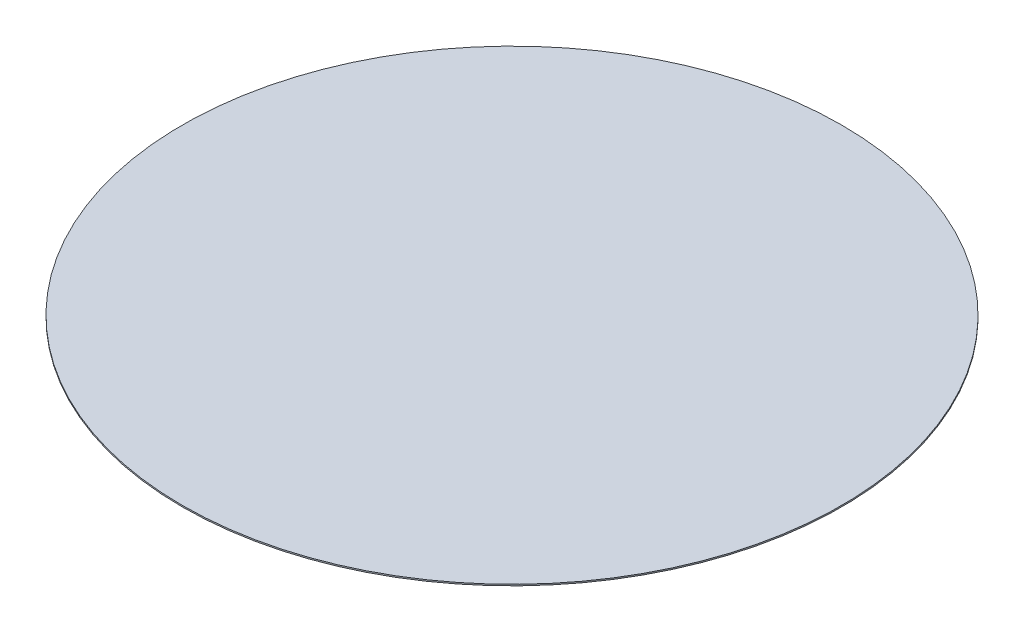
ISO-10303-21;
HEADER;
FILE_DESCRIPTION(('STEP AP214'),'2;1');
FILE_NAME('part.step','',(''),(''),'','','');
FILE_SCHEMA(('AUTOMOTIVE_DESIGN { 1 0 10303 214 1 1 1 1 }'));
ENDSEC;
DATA;
#1=APPLICATION_CONTEXT('core data for automotive mechanical design processes');
#2=APPLICATION_PROTOCOL_DEFINITION('international standard','automotive_design',2000,#1);
#3=PRODUCT_CONTEXT('',#1,'mechanical');
#4=PRODUCT('Part','Part','',(#3));
#5=PRODUCT_RELATED_PRODUCT_CATEGORY('part','',(#4));
#6=PRODUCT_DEFINITION_FORMATION('','',#4);
#7=PRODUCT_DEFINITION_CONTEXT('part definition',#1,'design');
#8=PRODUCT_DEFINITION('design','',#6,#7);
#9=PRODUCT_DEFINITION_SHAPE('','',#8);
#10=(LENGTH_UNIT() NAMED_UNIT(*) SI_UNIT(.MILLI.,.METRE.));
#11=(NAMED_UNIT(*) PLANE_ANGLE_UNIT() SI_UNIT($,.RADIAN.));
#12=(NAMED_UNIT(*) SI_UNIT($,.STERADIAN.) SOLID_ANGLE_UNIT());
#13=UNCERTAINTY_MEASURE_WITH_UNIT(LENGTH_MEASURE(1.E-05),#10,'distance_accuracy_value','');
#14=(GEOMETRIC_REPRESENTATION_CONTEXT(3) GLOBAL_UNCERTAINTY_ASSIGNED_CONTEXT((#13)) GLOBAL_UNIT_ASSIGNED_CONTEXT((#10,
#11,#12)) REPRESENTATION_CONTEXT('',''));
#15=CARTESIAN_POINT('',(0.,0.,0.));
#16=DIRECTION('',(0.,0.,1.));
#17=DIRECTION('',(1.,0.,0.));
#18=AXIS2_PLACEMENT_3D('',#15,#16,#17);
#19=CARTESIAN_POINT('',(0.,0.1,0.));
#20=DIRECTION('',(0.,-1.,0.));
#21=DIRECTION('',(0.,0.,-1.));
#22=AXIS2_PLACEMENT_3D('',#19,#20,#21);
#23=CYLINDRICAL_SURFACE('',#22,24.);
#24=CARTESIAN_POINT('',(0.,0.1,0.));
#25=DIRECTION('',(0.,1.,0.));
#26=DIRECTION('',(0.,0.,1.));
#27=AXIS2_PLACEMENT_3D('',#24,#25,#26);
#28=CIRCLE('',#27,24.);
#29=CARTESIAN_POINT('',(0.,0.1,24.));
#30=VERTEX_POINT('',#29);
#31=EDGE_CURVE('E10',#30,#30,#28,.T.);
#32=ORIENTED_EDGE('',*,*,#31,.F.);
#33=EDGE_LOOP('',(#32));
#34=FACE_BOUND('',#33,.T.);
#35=CARTESIAN_POINT('',(0.,0.,0.));
#36=DIRECTION('',(0.,1.,0.));
#37=DIRECTION('',(0.,0.,1.));
#38=AXIS2_PLACEMENT_3D('',#35,#36,#37);
#39=CIRCLE('',#38,24.);
#40=CARTESIAN_POINT('',(0.,0.,24.));
#41=VERTEX_POINT('',#40);
#42=EDGE_CURVE('E35',#41,#41,#39,.T.);
#43=ORIENTED_EDGE('',*,*,#42,.T.);
#44=EDGE_LOOP('',(#43));
#45=FACE_BOUND('',#44,.T.);
#46=ADVANCED_FACE('F32',(#34,#45),#23,.T.);
#47=CARTESIAN_POINT('',(0.,0.1,0.));
#48=DIRECTION('',(0.,1.,0.));
#49=DIRECTION('',(0.,0.,1.));
#50=AXIS2_PLACEMENT_3D('',#47,#48,#49);
#51=PLANE('',#50);
#52=ORIENTED_EDGE('',*,*,#31,.T.);
#53=EDGE_LOOP('',(#52));
#54=FACE_BOUND('',#53,.T.);
#55=ADVANCED_FACE('F47',(#54),#51,.T.);
#56=CARTESIAN_POINT('',(0.,0.,0.));
#57=DIRECTION('',(0.,1.,0.));
#58=DIRECTION('',(0.,0.,1.));
#59=AXIS2_PLACEMENT_3D('',#56,#57,#58);
#60=PLANE('',#59);
#61=ORIENTED_EDGE('',*,*,#42,.F.);
#62=EDGE_LOOP('',(#61));
#63=FACE_BOUND('',#62,.T.);
#64=ADVANCED_FACE('F45',(#63),#60,.F.);
#65=CLOSED_SHELL('',(#46,#55,#64));
#66=MANIFOLD_SOLID_BREP('B2',#65);
#67=ADVANCED_BREP_SHAPE_REPRESENTATION('',(#18,#66),#14);
#68=SHAPE_DEFINITION_REPRESENTATION(#9,#67);
ENDSEC;
END-ISO-10303-21;
